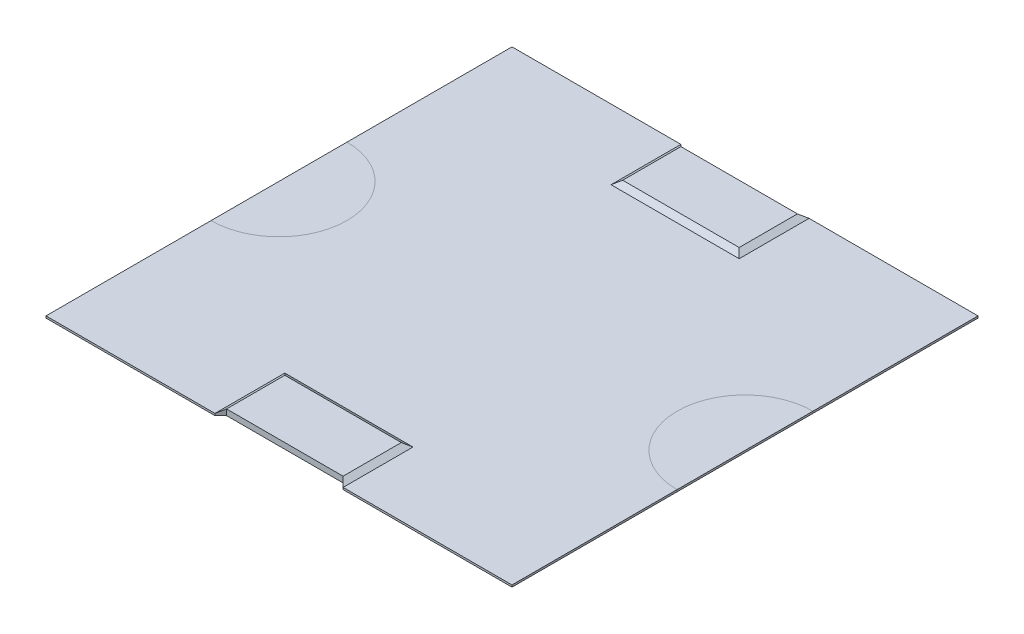
ISO-10303-21;
HEADER;
FILE_DESCRIPTION(('STEP AP214'),'2;1');
FILE_NAME('part.step','',(''),(''),'','','');
FILE_SCHEMA(('AUTOMOTIVE_DESIGN { 1 0 10303 214 1 1 1 1 }'));
ENDSEC;
DATA;
#1=APPLICATION_CONTEXT('core data for automotive mechanical design processes');
#2=APPLICATION_PROTOCOL_DEFINITION('international standard','automotive_design',2000,#1);
#3=PRODUCT_CONTEXT('',#1,'mechanical');
#4=PRODUCT('Part','Part','',(#3));
#5=PRODUCT_RELATED_PRODUCT_CATEGORY('part','',(#4));
#6=PRODUCT_DEFINITION_FORMATION('','',#4);
#7=PRODUCT_DEFINITION_CONTEXT('part definition',#1,'design');
#8=PRODUCT_DEFINITION('design','',#6,#7);
#9=PRODUCT_DEFINITION_SHAPE('','',#8);
#10=(LENGTH_UNIT() NAMED_UNIT(*) SI_UNIT(.MILLI.,.METRE.));
#11=(NAMED_UNIT(*) PLANE_ANGLE_UNIT() SI_UNIT($,.RADIAN.));
#12=(NAMED_UNIT(*) SI_UNIT($,.STERADIAN.) SOLID_ANGLE_UNIT());
#13=UNCERTAINTY_MEASURE_WITH_UNIT(LENGTH_MEASURE(1.E-05),#10,'distance_accuracy_value','');
#14=(GEOMETRIC_REPRESENTATION_CONTEXT(3) GLOBAL_UNCERTAINTY_ASSIGNED_CONTEXT((#13)) GLOBAL_UNIT_ASSIGNED_CONTEXT((#10,
#11,#12)) REPRESENTATION_CONTEXT('',''));
#15=CARTESIAN_POINT('',(0.,0.,0.));
#16=DIRECTION('',(0.,0.,1.));
#17=DIRECTION('',(1.,0.,0.));
#18=AXIS2_PLACEMENT_3D('',#15,#16,#17);
#19=CARTESIAN_POINT('',(2400.,10.,-1200.));
#20=DIRECTION('',(0.,-1.,0.));
#21=DIRECTION('',(0.,0.,-1.));
#22=AXIS2_PLACEMENT_3D('',#19,#20,#21);
#23=CYLINDRICAL_SURFACE('',#22,350.);
#24=CARTESIAN_POINT('',(2400.,0.,-1200.));
#25=DIRECTION('',(0.,1.,0.));
#26=DIRECTION('',(0.,0.,1.));
#27=AXIS2_PLACEMENT_3D('',#24,#25,#26);
#28=CIRCLE('',#27,350.);
#29=CARTESIAN_POINT('',(2400.,0.,-850.));
#30=VERTEX_POINT('',#29);
#31=CARTESIAN_POINT('',(2400.,0.,-1550.));
#32=VERTEX_POINT('',#31);
#33=EDGE_CURVE('E136',#30,#32,#28,.F.);
#34=ORIENTED_EDGE('',*,*,#33,.F.);
#35=DIRECTION('',(0.,-1.,0.));
#36=VECTOR('',#35,1.);
#37=CARTESIAN_POINT('',(2400.,10.,-850.));
#38=LINE('',#37,#36);
#39=CARTESIAN_POINT('',(2400.,10.,-850.));
#40=VERTEX_POINT('',#39);
#41=EDGE_CURVE('E13',#40,#30,#38,.T.);
#42=ORIENTED_EDGE('',*,*,#41,.F.);
#43=CARTESIAN_POINT('',(2400.,10.,-1200.));
#44=DIRECTION('',(0.,1.,0.));
#45=DIRECTION('',(0.,0.,1.));
#46=AXIS2_PLACEMENT_3D('',#43,#44,#45);
#47=CIRCLE('',#46,350.);
#48=CARTESIAN_POINT('',(2400.,10.,-1550.));
#49=VERTEX_POINT('',#48);
#50=EDGE_CURVE('E137',#40,#49,#47,.F.);
#51=ORIENTED_EDGE('',*,*,#50,.T.);
#52=DIRECTION('',(0.,-1.,0.));
#53=VECTOR('',#52,1.);
#54=CARTESIAN_POINT('',(2400.,10.,-1550.));
#55=LINE('',#54,#53);
#56=EDGE_CURVE('E116',#49,#32,#55,.T.);
#57=ORIENTED_EDGE('',*,*,#56,.T.);
#58=EDGE_LOOP('',(#34,#42,#51,#57));
#59=FACE_BOUND('',#58,.T.);
#60=ADVANCED_FACE('F108',(#59),#23,.T.);
#61=CARTESIAN_POINT('',(2400.,10.,0.));
#62=DIRECTION('',(-1.,0.,0.));
#63=DIRECTION('',(0.,0.,1.));
#64=AXIS2_PLACEMENT_3D('',#61,#62,#63);
#65=PLANE('',#64);
#66=DIRECTION('',(0.,0.,-1.));
#67=VECTOR('',#66,1.);
#68=CARTESIAN_POINT('',(2400.,0.,0.));
#69=LINE('',#68,#67);
#70=EDGE_CURVE('E138',#30,#32,#69,.T.);
#71=ORIENTED_EDGE('',*,*,#70,.T.);
#72=ORIENTED_EDGE('',*,*,#56,.F.);
#73=DIRECTION('',(0.,0.,-1.));
#74=VECTOR('',#73,1.);
#75=CARTESIAN_POINT('',(2400.,10.,0.));
#76=LINE('',#75,#74);
#77=EDGE_CURVE('E123',#40,#49,#76,.T.);
#78=ORIENTED_EDGE('',*,*,#77,.F.);
#79=ORIENTED_EDGE('',*,*,#41,.T.);
#80=EDGE_LOOP('',(#71,#72,#78,#79));
#81=FACE_BOUND('',#80,.T.);
#82=ADVANCED_FACE('F139',(#81),#65,.F.);
#83=CARTESIAN_POINT('',(0.,10.,0.));
#84=DIRECTION('',(0.,1.,0.));
#85=DIRECTION('',(0.,0.,1.));
#86=AXIS2_PLACEMENT_3D('',#83,#84,#85);
#87=PLANE('',#86);
#88=ORIENTED_EDGE('',*,*,#50,.F.);
#89=ORIENTED_EDGE('',*,*,#77,.T.);
#90=EDGE_LOOP('',(#88,#89));
#91=FACE_BOUND('',#90,.T.);
#92=ADVANCED_FACE('F147',(#91),#87,.T.);
#93=CARTESIAN_POINT('',(0.,0.,0.));
#94=DIRECTION('',(0.,1.,0.));
#95=DIRECTION('',(0.,0.,1.));
#96=AXIS2_PLACEMENT_3D('',#93,#94,#95);
#97=PLANE('',#96);
#98=ORIENTED_EDGE('',*,*,#33,.T.);
#99=ORIENTED_EDGE('',*,*,#70,.F.);
#100=EDGE_LOOP('',(#98,#99));
#101=FACE_BOUND('',#100,.T.);
#102=ADVANCED_FACE('F142',(#101),#97,.F.);
#103=CLOSED_SHELL('',(#60,#82,#92,#102));
#104=MANIFOLD_SOLID_BREP('B2',#103);
#105=CARTESIAN_POINT('',(0.,10.,0.));
#106=DIRECTION('',(-1.,0.,0.));
#107=DIRECTION('',(0.,0.,1.));
#108=AXIS2_PLACEMENT_3D('',#105,#106,#107);
#109=PLANE('',#108);
#110=DIRECTION('',(0.,0.,-1.));
#111=VECTOR('',#110,1.);
#112=CARTESIAN_POINT('',(0.,0.,0.));
#113=LINE('',#112,#111);
#114=CARTESIAN_POINT('',(0.,0.,-850.));
#115=VERTEX_POINT('',#114);
#116=CARTESIAN_POINT('',(0.,0.,-1550.));
#117=VERTEX_POINT('',#116);
#118=EDGE_CURVE('E233',#115,#117,#113,.T.);
#119=ORIENTED_EDGE('',*,*,#118,.F.);
#120=DIRECTION('',(0.,-1.,0.));
#121=VECTOR('',#120,1.);
#122=CARTESIAN_POINT('',(0.,10.,-850.));
#123=LINE('',#122,#121);
#124=CARTESIAN_POINT('',(0.,10.,-850.));
#125=VERTEX_POINT('',#124);
#126=EDGE_CURVE('E106',#125,#115,#123,.T.);
#127=ORIENTED_EDGE('',*,*,#126,.F.);
#128=DIRECTION('',(0.,0.,-1.));
#129=VECTOR('',#128,1.);
#130=CARTESIAN_POINT('',(0.,10.,0.));
#131=LINE('',#130,#129);
#132=CARTESIAN_POINT('',(0.,10.,-1550.));
#133=VERTEX_POINT('',#132);
#134=EDGE_CURVE('E234',#125,#133,#131,.T.);
#135=ORIENTED_EDGE('',*,*,#134,.T.);
#136=DIRECTION('',(0.,-1.,0.));
#137=VECTOR('',#136,1.);
#138=CARTESIAN_POINT('',(0.,10.,-1550.));
#139=LINE('',#138,#137);
#140=EDGE_CURVE('E213',#133,#117,#139,.T.);
#141=ORIENTED_EDGE('',*,*,#140,.T.);
#142=EDGE_LOOP('',(#119,#127,#135,#141));
#143=FACE_BOUND('',#142,.T.);
#144=ADVANCED_FACE('F205',(#143),#109,.T.);
#145=CARTESIAN_POINT('',(0.,10.,-1200.));
#146=DIRECTION('',(0.,-1.,0.));
#147=DIRECTION('',(0.,0.,-1.));
#148=AXIS2_PLACEMENT_3D('',#145,#146,#147);
#149=CYLINDRICAL_SURFACE('',#148,350.);
#150=CARTESIAN_POINT('',(0.,0.,-1200.));
#151=DIRECTION('',(0.,1.,0.));
#152=DIRECTION('',(0.,0.,1.));
#153=AXIS2_PLACEMENT_3D('',#150,#151,#152);
#154=CIRCLE('',#153,350.);
#155=EDGE_CURVE('E235',#115,#117,#154,.T.);
#156=ORIENTED_EDGE('',*,*,#155,.T.);
#157=ORIENTED_EDGE('',*,*,#140,.F.);
#158=CARTESIAN_POINT('',(0.,10.,-1200.));
#159=DIRECTION('',(0.,1.,0.));
#160=DIRECTION('',(0.,0.,1.));
#161=AXIS2_PLACEMENT_3D('',#158,#159,#160);
#162=CIRCLE('',#161,350.);
#163=EDGE_CURVE('E220',#125,#133,#162,.T.);
#164=ORIENTED_EDGE('',*,*,#163,.F.);
#165=ORIENTED_EDGE('',*,*,#126,.T.);
#166=EDGE_LOOP('',(#156,#157,#164,#165));
#167=FACE_BOUND('',#166,.T.);
#168=ADVANCED_FACE('F236',(#167),#149,.T.);
#169=CARTESIAN_POINT('',(0.,10.,0.));
#170=DIRECTION('',(0.,1.,0.));
#171=DIRECTION('',(0.,0.,1.));
#172=AXIS2_PLACEMENT_3D('',#169,#170,#171);
#173=PLANE('',#172);
#174=ORIENTED_EDGE('',*,*,#134,.F.);
#175=ORIENTED_EDGE('',*,*,#163,.T.);
#176=EDGE_LOOP('',(#174,#175));
#177=FACE_BOUND('',#176,.T.);
#178=ADVANCED_FACE('F244',(#177),#173,.T.);
#179=CARTESIAN_POINT('',(0.,0.,0.));
#180=DIRECTION('',(0.,1.,0.));
#181=DIRECTION('',(0.,0.,1.));
#182=AXIS2_PLACEMENT_3D('',#179,#180,#181);
#183=PLANE('',#182);
#184=ORIENTED_EDGE('',*,*,#118,.T.);
#185=ORIENTED_EDGE('',*,*,#155,.F.);
#186=EDGE_LOOP('',(#184,#185));
#187=FACE_BOUND('',#186,.T.);
#188=ADVANCED_FACE('F239',(#187),#183,.F.);
#189=CLOSED_SHELL('',(#144,#168,#178,#188));
#190=MANIFOLD_SOLID_BREP('B7',#189);
#191=CARTESIAN_POINT('',(2400.,10.,0.));
#192=DIRECTION('',(-1.,0.,0.));
#193=DIRECTION('',(0.,0.,1.));
#194=AXIS2_PLACEMENT_3D('',#191,#192,#193);
#195=PLANE('',#194);
#196=DIRECTION('',(0.,0.,-1.));
#197=VECTOR('',#196,1.);
#198=CARTESIAN_POINT('',(2400.,0.,0.));
#199=LINE('',#198,#197);
#200=CARTESIAN_POINT('',(2400.,0.,0.));
#201=VERTEX_POINT('',#200);
#202=CARTESIAN_POINT('',(2400.,0.,-850.));
#203=VERTEX_POINT('',#202);
#204=EDGE_CURVE('E767',#201,#203,#199,.T.);
#205=ORIENTED_EDGE('',*,*,#204,.T.);
#206=DIRECTION('',(0.,-1.,0.));
#207=VECTOR('',#206,1.);
#208=CARTESIAN_POINT('',(2400.,10.,-850.));
#209=LINE('',#208,#207);
#210=CARTESIAN_POINT('',(2400.,10.,-850.));
#211=VERTEX_POINT('',#210);
#212=EDGE_CURVE('E203',#211,#203,#209,.T.);
#213=ORIENTED_EDGE('',*,*,#212,.F.);
#214=DIRECTION('',(0.,0.,-1.));
#215=VECTOR('',#214,1.);
#216=CARTESIAN_POINT('',(2400.,10.,0.));
#217=LINE('',#216,#215);
#218=CARTESIAN_POINT('',(2400.,10.,0.));
#219=VERTEX_POINT('',#218);
#220=EDGE_CURVE('E720',#219,#211,#217,.T.);
#221=ORIENTED_EDGE('',*,*,#220,.F.);
#222=DIRECTION('',(0.,-1.,0.));
#223=VECTOR('',#222,1.);
#224=CARTESIAN_POINT('',(2400.,10.,0.));
#225=LINE('',#224,#223);
#226=EDGE_CURVE('E662',#219,#201,#225,.T.);
#227=ORIENTED_EDGE('',*,*,#226,.T.);
#228=EDGE_LOOP('',(#205,#213,#221,#227));
#229=FACE_BOUND('',#228,.T.);
#230=ADVANCED_FACE('F293',(#229),#195,.F.);
#231=CARTESIAN_POINT('',(2400.,10.,-1200.));
#232=DIRECTION('',(0.,-1.,0.));
#233=DIRECTION('',(0.,0.,-1.));
#234=AXIS2_PLACEMENT_3D('',#231,#232,#233);
#235=CYLINDRICAL_SURFACE('',#234,350.);
#236=CARTESIAN_POINT('',(2400.,0.,-1200.));
#237=DIRECTION('',(0.,1.,0.));
#238=DIRECTION('',(0.,0.,1.));
#239=AXIS2_PLACEMENT_3D('',#236,#237,#238);
#240=CIRCLE('',#239,350.);
#241=CARTESIAN_POINT('',(2400.,0.,-1550.));
#242=VERTEX_POINT('',#241);
#243=EDGE_CURVE('E652',#203,#242,#240,.F.);
#244=ORIENTED_EDGE('',*,*,#243,.T.);
#245=DIRECTION('',(0.,-1.,0.));
#246=VECTOR('',#245,1.);
#247=CARTESIAN_POINT('',(2400.,10.,-1550.));
#248=LINE('',#247,#246);
#249=CARTESIAN_POINT('',(2400.,10.,-1550.));
#250=VERTEX_POINT('',#249);
#251=EDGE_CURVE('E303',#250,#242,#248,.T.);
#252=ORIENTED_EDGE('',*,*,#251,.F.);
#253=CARTESIAN_POINT('',(2400.,10.,-1200.));
#254=DIRECTION('',(0.,1.,0.));
#255=DIRECTION('',(0.,0.,1.));
#256=AXIS2_PLACEMENT_3D('',#253,#254,#255);
#257=CIRCLE('',#256,350.);
#258=EDGE_CURVE('E722',#211,#250,#257,.F.);
#259=ORIENTED_EDGE('',*,*,#258,.F.);
#260=ORIENTED_EDGE('',*,*,#212,.T.);
#261=EDGE_LOOP('',(#244,#252,#259,#260));
#262=FACE_BOUND('',#261,.T.);
#263=ADVANCED_FACE('F295',(#262),#235,.F.);
#264=CARTESIAN_POINT('',(2400.,0.,-2400.));
#265=VERTEX_POINT('',#264);
#266=EDGE_CURVE('E646',#242,#265,#199,.T.);
#267=ORIENTED_EDGE('',*,*,#266,.T.);
#268=DIRECTION('',(0.,-1.,0.));
#269=VECTOR('',#268,1.);
#270=CARTESIAN_POINT('',(2400.,10.,-2400.));
#271=LINE('',#270,#269);
#272=CARTESIAN_POINT('',(2400.,10.,-2400.));
#273=VERTEX_POINT('',#272);
#274=EDGE_CURVE('E672',#273,#265,#271,.T.);
#275=ORIENTED_EDGE('',*,*,#274,.F.);
#276=EDGE_CURVE('E723',#250,#273,#217,.T.);
#277=ORIENTED_EDGE('',*,*,#276,.F.);
#278=ORIENTED_EDGE('',*,*,#251,.T.);
#279=EDGE_LOOP('',(#267,#275,#277,#278));
#280=FACE_BOUND('',#279,.T.);
#281=ADVANCED_FACE('F750',(#280),#195,.F.);
#282=CARTESIAN_POINT('',(0.,10.,-2400.));
#283=DIRECTION('',(0.,0.,-1.));
#284=DIRECTION('',(-1.,0.,0.));
#285=AXIS2_PLACEMENT_3D('',#282,#283,#284);
#286=PLANE('',#285);
#287=DIRECTION('',(1.,0.,0.));
#288=VECTOR('',#287,1.);
#289=CARTESIAN_POINT('',(0.,0.,-2400.));
#290=LINE('',#289,#288);
#291=CARTESIAN_POINT('',(1530.,0.,-2400.));
#292=VERTEX_POINT('',#291);
#293=EDGE_CURVE('E641',#292,#265,#290,.T.);
#294=ORIENTED_EDGE('',*,*,#293,.F.);
#295=CARTESIAN_POINT('',(1530.,10.,-2400.));
#296=DIRECTION('',(0.,-1.,0.));
#297=VECTOR('',#296,1.);
#298=LINE('',#295,#297);
#299=CARTESIAN_POINT('',(1530.,10.,-2400.));
#300=VERTEX_POINT('',#299);
#301=EDGE_CURVE('E674',#300,#292,#298,.T.);
#302=ORIENTED_EDGE('',*,*,#301,.F.);
#303=DIRECTION('',(1.,0.,0.));
#304=VECTOR('',#303,1.);
#305=CARTESIAN_POINT('',(0.,10.,-2400.));
#306=LINE('',#305,#304);
#307=EDGE_CURVE('E731',#300,#273,#306,.T.);
#308=ORIENTED_EDGE('',*,*,#307,.T.);
#309=ORIENTED_EDGE('',*,*,#274,.T.);
#310=EDGE_LOOP('',(#294,#302,#308,#309));
#311=FACE_BOUND('',#310,.T.);
#312=ADVANCED_FACE('F746',(#311),#286,.T.);
#313=CARTESIAN_POINT('',(0.,0.,-2400.));
#314=VERTEX_POINT('',#313);
#315=CARTESIAN_POINT('',(870.,0.,-2400.));
#316=VERTEX_POINT('',#315);
#317=EDGE_CURVE('E645',#314,#316,#290,.T.);
#318=ORIENTED_EDGE('',*,*,#317,.F.);
#319=DIRECTION('',(0.,-1.,0.));
#320=VECTOR('',#319,1.);
#321=CARTESIAN_POINT('',(0.,10.,-2400.));
#322=LINE('',#321,#320);
#323=CARTESIAN_POINT('',(0.,10.,-2400.));
#324=VERTEX_POINT('',#323);
#325=EDGE_CURVE('E670',#324,#314,#322,.T.);
#326=ORIENTED_EDGE('',*,*,#325,.F.);
#327=CARTESIAN_POINT('',(870.,9.99999999999998,-2400.));
#328=VERTEX_POINT('',#327);
#329=EDGE_CURVE('E725',#324,#328,#306,.T.);
#330=ORIENTED_EDGE('',*,*,#329,.T.);
#331=DIRECTION('',(0.,1.,0.));
#332=VECTOR('',#331,1.);
#333=CARTESIAN_POINT('',(870.,10.,-2400.));
#334=LINE('',#333,#332);
#335=EDGE_CURVE('E568',#328,#316,#334,.F.);
#336=ORIENTED_EDGE('',*,*,#335,.T.);
#337=EDGE_LOOP('',(#318,#326,#330,#336));
#338=FACE_BOUND('',#337,.T.);
#339=ADVANCED_FACE('F736',(#338),#286,.T.);
#340=CARTESIAN_POINT('',(0.,10.,0.));
#341=DIRECTION('',(-1.,0.,0.));
#342=DIRECTION('',(0.,0.,1.));
#343=AXIS2_PLACEMENT_3D('',#340,#341,#342);
#344=PLANE('',#343);
#345=DIRECTION('',(0.,0.,-1.));
#346=VECTOR('',#345,1.);
#347=CARTESIAN_POINT('',(0.,0.,0.));
#348=LINE('',#347,#346);
#349=CARTESIAN_POINT('',(0.,0.,-1550.));
#350=VERTEX_POINT('',#349);
#351=EDGE_CURVE('E651',#350,#314,#348,.T.);
#352=ORIENTED_EDGE('',*,*,#351,.F.);
#353=DIRECTION('',(0.,-1.,0.));
#354=VECTOR('',#353,1.);
#355=CARTESIAN_POINT('',(0.,10.,-1550.));
#356=LINE('',#355,#354);
#357=CARTESIAN_POINT('',(0.,10.,-1550.));
#358=VERTEX_POINT('',#357);
#359=EDGE_CURVE('E668',#358,#350,#356,.T.);
#360=ORIENTED_EDGE('',*,*,#359,.F.);
#361=DIRECTION('',(0.,0.,-1.));
#362=VECTOR('',#361,1.);
#363=CARTESIAN_POINT('',(0.,10.,0.));
#364=LINE('',#363,#362);
#365=EDGE_CURVE('E729',#358,#324,#364,.T.);
#366=ORIENTED_EDGE('',*,*,#365,.T.);
#367=ORIENTED_EDGE('',*,*,#325,.T.);
#368=EDGE_LOOP('',(#352,#360,#366,#367));
#369=FACE_BOUND('',#368,.T.);
#370=ADVANCED_FACE('F745',(#369),#344,.T.);
#371=CARTESIAN_POINT('',(0.,10.,-1200.));
#372=DIRECTION('',(0.,-1.,0.));
#373=DIRECTION('',(0.,0.,-1.));
#374=AXIS2_PLACEMENT_3D('',#371,#372,#373);
#375=CYLINDRICAL_SURFACE('',#374,350.);
#376=CARTESIAN_POINT('',(0.,0.,-1200.));
#377=DIRECTION('',(0.,1.,0.));
#378=DIRECTION('',(0.,0.,1.));
#379=AXIS2_PLACEMENT_3D('',#376,#377,#378);
#380=CIRCLE('',#379,350.);
#381=CARTESIAN_POINT('',(0.,0.,-850.));
#382=VERTEX_POINT('',#381);
#383=EDGE_CURVE('E656',#382,#350,#380,.T.);
#384=ORIENTED_EDGE('',*,*,#383,.F.);
#385=DIRECTION('',(0.,-1.,0.));
#386=VECTOR('',#385,1.);
#387=CARTESIAN_POINT('',(0.,10.,-850.));
#388=LINE('',#387,#386);
#389=CARTESIAN_POINT('',(0.,10.,-850.));
#390=VERTEX_POINT('',#389);
#391=EDGE_CURVE('E666',#390,#382,#388,.T.);
#392=ORIENTED_EDGE('',*,*,#391,.F.);
#393=CARTESIAN_POINT('',(0.,10.,-1200.));
#394=DIRECTION('',(0.,1.,0.));
#395=DIRECTION('',(0.,0.,1.));
#396=AXIS2_PLACEMENT_3D('',#393,#394,#395);
#397=CIRCLE('',#396,350.);
#398=EDGE_CURVE('E1127',#390,#358,#397,.T.);
#399=ORIENTED_EDGE('',*,*,#398,.T.);
#400=ORIENTED_EDGE('',*,*,#359,.T.);
#401=EDGE_LOOP('',(#384,#392,#399,#400));
#402=FACE_BOUND('',#401,.T.);
#403=ADVANCED_FACE('F748',(#402),#375,.F.);
#404=CARTESIAN_POINT('',(0.,0.,0.));
#405=VERTEX_POINT('',#404);
#406=EDGE_CURVE('E657',#405,#382,#348,.T.);
#407=ORIENTED_EDGE('',*,*,#406,.F.);
#408=DIRECTION('',(0.,-1.,0.));
#409=VECTOR('',#408,1.);
#410=CARTESIAN_POINT('',(0.,10.,0.));
#411=LINE('',#410,#409);
#412=CARTESIAN_POINT('',(0.,10.,0.));
#413=VERTEX_POINT('',#412);
#414=EDGE_CURVE('E441',#413,#405,#411,.T.);
#415=ORIENTED_EDGE('',*,*,#414,.F.);
#416=EDGE_CURVE('E454',#413,#390,#364,.T.);
#417=ORIENTED_EDGE('',*,*,#416,.T.);
#418=ORIENTED_EDGE('',*,*,#391,.T.);
#419=EDGE_LOOP('',(#407,#415,#417,#418));
#420=FACE_BOUND('',#419,.T.);
#421=ADVANCED_FACE('F883',(#420),#344,.T.);
#422=CARTESIAN_POINT('',(0.,10.,0.));
#423=DIRECTION('',(0.,0.,-1.));
#424=DIRECTION('',(-1.,0.,0.));
#425=AXIS2_PLACEMENT_3D('',#422,#423,#424);
#426=PLANE('',#425);
#427=DIRECTION('',(1.,0.,0.));
#428=VECTOR('',#427,1.);
#429=CARTESIAN_POINT('',(0.,0.,0.));
#430=LINE('',#429,#428);
#431=CARTESIAN_POINT('',(870.,0.,0.));
#432=VERTEX_POINT('',#431);
#433=EDGE_CURVE('E461',#405,#432,#430,.T.);
#434=ORIENTED_EDGE('',*,*,#433,.T.);
#435=DIRECTION('',(0.,-1.,0.));
#436=VECTOR('',#435,1.);
#437=CARTESIAN_POINT('',(870.,10.,0.));
#438=LINE('',#437,#436);
#439=CARTESIAN_POINT('',(870.,10.,0.));
#440=VERTEX_POINT('',#439);
#441=EDGE_CURVE('E458',#440,#432,#438,.T.);
#442=ORIENTED_EDGE('',*,*,#441,.F.);
#443=DIRECTION('',(1.,0.,0.));
#444=VECTOR('',#443,1.);
#445=CARTESIAN_POINT('',(0.,10.,0.));
#446=LINE('',#445,#444);
#447=EDGE_CURVE('E446',#413,#440,#446,.T.);
#448=ORIENTED_EDGE('',*,*,#447,.F.);
#449=ORIENTED_EDGE('',*,*,#414,.T.);
#450=EDGE_LOOP('',(#434,#442,#448,#449));
#451=FACE_BOUND('',#450,.T.);
#452=ADVANCED_FACE('F459',(#451),#426,.F.);
#453=CARTESIAN_POINT('',(1530.,0.,0.));
#454=VERTEX_POINT('',#453);
#455=EDGE_CURVE('E661',#454,#201,#430,.T.);
#456=ORIENTED_EDGE('',*,*,#455,.T.);
#457=ORIENTED_EDGE('',*,*,#226,.F.);
#458=CARTESIAN_POINT('',(1530.,9.99999999999997,0.));
#459=VERTEX_POINT('',#458);
#460=EDGE_CURVE('E312',#459,#219,#446,.T.);
#461=ORIENTED_EDGE('',*,*,#460,.F.);
#462=DIRECTION('',(0.,1.,0.));
#463=VECTOR('',#462,1.);
#464=CARTESIAN_POINT('',(1530.,10.,0.));
#465=LINE('',#464,#463);
#466=EDGE_CURVE('E466',#459,#454,#465,.F.);
#467=ORIENTED_EDGE('',*,*,#466,.T.);
#468=EDGE_LOOP('',(#456,#457,#461,#467));
#469=FACE_BOUND('',#468,.T.);
#470=ADVANCED_FACE('F538',(#469),#426,.F.);
#471=CARTESIAN_POINT('',(0.,10.,0.));
#472=DIRECTION('',(0.,1.,0.));
#473=DIRECTION('',(0.,0.,1.));
#474=AXIS2_PLACEMENT_3D('',#471,#472,#473);
#475=PLANE('',#474);
#476=ORIENTED_EDGE('',*,*,#220,.T.);
#477=ORIENTED_EDGE('',*,*,#258,.T.);
#478=ORIENTED_EDGE('',*,*,#276,.T.);
#479=ORIENTED_EDGE('',*,*,#307,.F.);
#480=CARTESIAN_POINT('',(1530.,9.99999999999956,-2040.));
#481=DIRECTION('',(0.,0.,-1.));
#482=VECTOR('',#481,1.);
#483=LINE('',#480,#482);
#484=CARTESIAN_POINT('',(1530.,10.,-2040.));
#485=VERTEX_POINT('',#484);
#486=EDGE_CURVE('E638',#485,#300,#483,.T.);
#487=ORIENTED_EDGE('',*,*,#486,.F.);
#488=DIRECTION('',(1.,0.,0.));
#489=VECTOR('',#488,1.);
#490=CARTESIAN_POINT('',(0.,10.,-2040.));
#491=LINE('',#490,#489);
#492=CARTESIAN_POINT('',(870.,10.0000000000001,-2040.));
#493=VERTEX_POINT('',#492);
#494=EDGE_CURVE('E635',#493,#485,#491,.T.);
#495=ORIENTED_EDGE('',*,*,#494,.F.);
#496=DIRECTION('',(0.,0.,1.));
#497=VECTOR('',#496,1.);
#498=CARTESIAN_POINT('',(870.,10.,0.));
#499=LINE('',#498,#497);
#500=EDGE_CURVE('E637',#493,#328,#499,.F.);
#501=ORIENTED_EDGE('',*,*,#500,.T.);
#502=ORIENTED_EDGE('',*,*,#329,.F.);
#503=ORIENTED_EDGE('',*,*,#365,.F.);
#504=ORIENTED_EDGE('',*,*,#398,.F.);
#505=ORIENTED_EDGE('',*,*,#416,.F.);
#506=ORIENTED_EDGE('',*,*,#447,.T.);
#507=DIRECTION('',(0.,0.,1.));
#508=VECTOR('',#507,1.);
#509=CARTESIAN_POINT('',(870.,10.,0.));
#510=LINE('',#509,#508);
#511=CARTESIAN_POINT('',(870.,10.,-359.999999999999));
#512=VERTEX_POINT('',#511);
#513=EDGE_CURVE('E451',#512,#440,#510,.T.);
#514=ORIENTED_EDGE('',*,*,#513,.F.);
#515=DIRECTION('',(1.,0.,0.));
#516=VECTOR('',#515,1.);
#517=CARTESIAN_POINT('',(0.,10.,-359.999999999999));
#518=LINE('',#517,#516);
#519=CARTESIAN_POINT('',(1530.,10.,-359.999999999999));
#520=VERTEX_POINT('',#519);
#521=EDGE_CURVE('E474',#512,#520,#518,.T.);
#522=ORIENTED_EDGE('',*,*,#521,.T.);
#523=DIRECTION('',(0.,0.,1.));
#524=VECTOR('',#523,1.);
#525=CARTESIAN_POINT('',(1530.,10.,0.));
#526=LINE('',#525,#524);
#527=EDGE_CURVE('E714',#520,#459,#526,.T.);
#528=ORIENTED_EDGE('',*,*,#527,.T.);
#529=ORIENTED_EDGE('',*,*,#460,.T.);
#530=EDGE_LOOP('',(#476,#477,#478,#479,#487,#495,#501,#502,#503,#504,#505,#506,#514,#522,#528,#529));
#531=FACE_BOUND('',#530,.T.);
#532=ADVANCED_FACE('F448',(#531),#475,.T.);
#533=CARTESIAN_POINT('',(0.,0.,0.));
#534=DIRECTION('',(0.,1.,0.));
#535=DIRECTION('',(0.,0.,1.));
#536=AXIS2_PLACEMENT_3D('',#533,#534,#535);
#537=PLANE('',#536);
#538=DIRECTION('',(0.70710678118655,0.,-0.707106781186545));
#539=VECTOR('',#538,1.);
#540=CARTESIAN_POINT('',(1500.,0.,-2370.));
#541=LINE('',#540,#539);
#542=CARTESIAN_POINT('',(1500.,0.,-2370.));
#543=VERTEX_POINT('',#542);
#544=EDGE_CURVE('E774',#543,#292,#541,.T.);
#545=ORIENTED_EDGE('',*,*,#544,.T.);
#546=ORIENTED_EDGE('',*,*,#293,.T.);
#547=ORIENTED_EDGE('',*,*,#266,.F.);
#548=ORIENTED_EDGE('',*,*,#243,.F.);
#549=ORIENTED_EDGE('',*,*,#204,.F.);
#550=ORIENTED_EDGE('',*,*,#455,.F.);
#551=DIRECTION('',(-0.70710678118655,0.,-0.707106781186545));
#552=VECTOR('',#551,1.);
#553=CARTESIAN_POINT('',(1530.,0.,0.));
#554=LINE('',#553,#552);
#555=CARTESIAN_POINT('',(1500.,0.,-29.9999999999998));
#556=VERTEX_POINT('',#555);
#557=EDGE_CURVE('E499',#454,#556,#554,.T.);
#558=ORIENTED_EDGE('',*,*,#557,.T.);
#559=DIRECTION('',(1.,0.,0.));
#560=VECTOR('',#559,1.);
#561=CARTESIAN_POINT('',(0.,0.,-29.9999999999998));
#562=LINE('',#561,#560);
#563=CARTESIAN_POINT('',(900.,0.,-29.9999999999998));
#564=VERTEX_POINT('',#563);
#565=EDGE_CURVE('E481',#564,#556,#562,.T.);
#566=ORIENTED_EDGE('',*,*,#565,.F.);
#567=DIRECTION('',(-0.70710678118655,0.,0.707106781186545));
#568=VECTOR('',#567,1.);
#569=CARTESIAN_POINT('',(900.,0.,-29.9999999999998));
#570=LINE('',#569,#568);
#571=EDGE_CURVE('E479',#564,#432,#570,.T.);
#572=ORIENTED_EDGE('',*,*,#571,.T.);
#573=ORIENTED_EDGE('',*,*,#433,.F.);
#574=ORIENTED_EDGE('',*,*,#406,.T.);
#575=ORIENTED_EDGE('',*,*,#383,.T.);
#576=ORIENTED_EDGE('',*,*,#351,.T.);
#577=ORIENTED_EDGE('',*,*,#317,.T.);
#578=DIRECTION('',(0.70710678118655,0.,0.707106781186545));
#579=VECTOR('',#578,1.);
#580=CARTESIAN_POINT('',(870.,0.,-2400.));
#581=LINE('',#580,#579);
#582=CARTESIAN_POINT('',(900.,0.,-2370.));
#583=VERTEX_POINT('',#582);
#584=EDGE_CURVE('E1135',#316,#583,#581,.T.);
#585=ORIENTED_EDGE('',*,*,#584,.T.);
#586=DIRECTION('',(1.,0.,0.));
#587=VECTOR('',#586,1.);
#588=CARTESIAN_POINT('',(0.,0.,-2370.));
#589=LINE('',#588,#587);
#590=EDGE_CURVE('E552',#583,#543,#589,.T.);
#591=ORIENTED_EDGE('',*,*,#590,.T.);
#592=EDGE_LOOP('',(#545,#546,#547,#548,#549,#550,#558,#566,#572,#573,#574,#575,#576,#577,#585,#591));
#593=FACE_BOUND('',#592,.T.);
#594=ADVANCED_FACE('F537',(#593),#537,.F.);
#595=CARTESIAN_POINT('',(475.384615384615,713.076923076923,0.));
#596=DIRECTION('',(-0.554700196225229,-0.832050294337844,0.));
#597=DIRECTION('',(0.832050294337844,-0.554700196225229,0.));
#598=AXIS2_PLACEMENT_3D('',#595,#596,#597);
#599=PLANE('',#598);
#600=DIRECTION('',(-0.639602149066833,0.426401432711222,0.639602149066829));
#601=VECTOR('',#600,1.);
#602=CARTESIAN_POINT('',(1530.,10.,-359.999999999999));
#603=LINE('',#602,#601);
#604=CARTESIAN_POINT('',(1500.,30.,-330.));
#605=VERTEX_POINT('',#604);
#606=EDGE_CURVE('E492',#520,#605,#603,.T.);
#607=ORIENTED_EDGE('',*,*,#606,.T.);
#608=DIRECTION('',(0.,0.,-1.));
#609=VECTOR('',#608,1.);
#610=CARTESIAN_POINT('',(1500.,30.,0.));
#611=LINE('',#610,#609);
#612=CARTESIAN_POINT('',(1500.,30.,-29.9999999999998));
#613=VERTEX_POINT('',#612);
#614=EDGE_CURVE('E501',#613,#605,#611,.T.);
#615=ORIENTED_EDGE('',*,*,#614,.F.);
#616=DIRECTION('',(-0.639602149066833,0.426401432711222,-0.639602149066829));
#617=VECTOR('',#616,1.);
#618=CARTESIAN_POINT('',(1530.,10.,0.));
#619=LINE('',#618,#617);
#620=EDGE_CURVE('E496',#459,#613,#619,.T.);
#621=ORIENTED_EDGE('',*,*,#620,.F.);
#622=ORIENTED_EDGE('',*,*,#527,.F.);
#623=EDGE_LOOP('',(#607,#615,#621,#622));
#624=FACE_BOUND('',#623,.T.);
#625=ADVANCED_FACE('F531',(#624),#599,.F.);
#626=CARTESIAN_POINT('',(764.999999999994,0.,-765.));
#627=DIRECTION('',(-0.707106781186545,0.,0.70710678118655));
#628=DIRECTION('',(0.70710678118655,0.,0.707106781186545));
#629=AXIS2_PLACEMENT_3D('',#626,#627,#628);
#630=PLANE('',#629);
#631=ORIENTED_EDGE('',*,*,#620,.T.);
#632=DIRECTION('',(0.,-1.,0.));
#633=VECTOR('',#632,1.);
#634=CARTESIAN_POINT('',(1500.,30.,-29.9999999999998));
#635=LINE('',#634,#633);
#636=EDGE_CURVE('E513',#613,#556,#635,.T.);
#637=ORIENTED_EDGE('',*,*,#636,.T.);
#638=ORIENTED_EDGE('',*,*,#557,.F.);
#639=ORIENTED_EDGE('',*,*,#466,.F.);
#640=EDGE_LOOP('',(#631,#637,#638,#639));
#641=FACE_BOUND('',#640,.T.);
#642=ADVANCED_FACE('F520',(#641),#630,.T.);
#643=CARTESIAN_POINT('',(0.,30.,-29.9999999999998));
#644=DIRECTION('',(0.,0.,-1.));
#645=DIRECTION('',(-1.,0.,0.));
#646=AXIS2_PLACEMENT_3D('',#643,#644,#645);
#647=PLANE('',#646);
#648=ORIENTED_EDGE('',*,*,#565,.T.);
#649=ORIENTED_EDGE('',*,*,#636,.F.);
#650=DIRECTION('',(1.,0.,0.));
#651=VECTOR('',#650,1.);
#652=CARTESIAN_POINT('',(0.,30.,-29.9999999999998));
#653=LINE('',#652,#651);
#654=CARTESIAN_POINT('',(900.,30.,-29.9999999999998));
#655=VERTEX_POINT('',#654);
#656=EDGE_CURVE('E688',#655,#613,#653,.T.);
#657=ORIENTED_EDGE('',*,*,#656,.F.);
#658=DIRECTION('',(0.,-1.,0.));
#659=VECTOR('',#658,1.);
#660=CARTESIAN_POINT('',(900.,30.,-29.9999999999998));
#661=LINE('',#660,#659);
#662=EDGE_CURVE('E478',#655,#564,#661,.T.);
#663=ORIENTED_EDGE('',*,*,#662,.T.);
#664=EDGE_LOOP('',(#648,#649,#657,#663));
#665=FACE_BOUND('',#664,.T.);
#666=ADVANCED_FACE('F530',(#665),#647,.F.);
#667=CARTESIAN_POINT('',(0.,30.,0.));
#668=DIRECTION('',(0.,1.,0.));
#669=DIRECTION('',(0.,0.,1.));
#670=AXIS2_PLACEMENT_3D('',#667,#668,#669);
#671=PLANE('',#670);
#672=DIRECTION('',(0.,0.,-1.));
#673=VECTOR('',#672,1.);
#674=CARTESIAN_POINT('',(900.,30.,0.));
#675=LINE('',#674,#673);
#676=CARTESIAN_POINT('',(899.9999825,30.,-329.999999999999));
#677=VERTEX_POINT('',#676);
#678=EDGE_CURVE('E1164',#655,#677,#675,.T.);
#679=ORIENTED_EDGE('',*,*,#678,.F.);
#680=ORIENTED_EDGE('',*,*,#656,.T.);
#681=ORIENTED_EDGE('',*,*,#614,.T.);
#682=CARTESIAN_POINT('',(900.,29.9999999999998,-329.999999999999));
#683=DIRECTION('',(1.,0.,0.));
#684=VECTOR('',#683,1.);
#685=LINE('',#682,#684);
#686=EDGE_CURVE('E493',#677,#605,#685,.T.);
#687=ORIENTED_EDGE('',*,*,#686,.F.);
#688=EDGE_LOOP('',(#679,#680,#681,#687));
#689=FACE_BOUND('',#688,.T.);
#690=ADVANCED_FACE('F690',(#689),#671,.T.);
#691=CARTESIAN_POINT('',(263.076923076923,-394.615384615384,0.));
#692=DIRECTION('',(-0.554700196225229,0.832050294337844,0.));
#693=DIRECTION('',(-0.832050294337844,-0.554700196225229,0.));
#694=AXIS2_PLACEMENT_3D('',#691,#692,#693);
#695=PLANE('',#694);
#696=DIRECTION('',(-0.639602149066833,-0.426401432711222,-0.639602149066829));
#697=VECTOR('',#696,1.);
#698=CARTESIAN_POINT('',(900.,30.,-330.));
#699=LINE('',#698,#697);
#700=EDGE_CURVE('E473',#677,#512,#699,.T.);
#701=ORIENTED_EDGE('',*,*,#700,.T.);
#702=ORIENTED_EDGE('',*,*,#513,.T.);
#703=DIRECTION('',(-0.639602149066833,-0.426401432711222,0.639602149066829));
#704=VECTOR('',#703,1.);
#705=CARTESIAN_POINT('',(900.,30.,-29.9999999999998));
#706=LINE('',#705,#704);
#707=EDGE_CURVE('E472',#655,#440,#706,.T.);
#708=ORIENTED_EDGE('',*,*,#707,.F.);
#709=ORIENTED_EDGE('',*,*,#678,.T.);
#710=EDGE_LOOP('',(#701,#702,#708,#709));
#711=FACE_BOUND('',#710,.T.);
#712=ADVANCED_FACE('F470',(#711),#695,.T.);
#713=CARTESIAN_POINT('',(434.999999999997,0.,435.));
#714=DIRECTION('',(0.707106781186545,0.,0.70710678118655));
#715=DIRECTION('',(0.70710678118655,0.,-0.707106781186545));
#716=AXIS2_PLACEMENT_3D('',#713,#714,#715);
#717=PLANE('',#716);
#718=ORIENTED_EDGE('',*,*,#707,.T.);
#719=ORIENTED_EDGE('',*,*,#441,.T.);
#720=ORIENTED_EDGE('',*,*,#571,.F.);
#721=ORIENTED_EDGE('',*,*,#662,.F.);
#722=EDGE_LOOP('',(#718,#719,#720,#721));
#723=FACE_BOUND('',#722,.T.);
#724=ADVANCED_FACE('F477',(#723),#717,.T.);
#725=CARTESIAN_POINT('',(0.,173.076923076923,-115.384615384616));
#726=DIRECTION('',(0.,-0.832050294337842,0.554700196225231));
#727=DIRECTION('',(0.,-0.554700196225231,-0.832050294337842));
#728=AXIS2_PLACEMENT_3D('',#725,#726,#727);
#729=PLANE('',#728);
#730=ORIENTED_EDGE('',*,*,#700,.F.);
#731=ORIENTED_EDGE('',*,*,#686,.T.);
#732=ORIENTED_EDGE('',*,*,#606,.F.);
#733=ORIENTED_EDGE('',*,*,#521,.F.);
#734=EDGE_LOOP('',(#730,#731,#732,#733));
#735=FACE_BOUND('',#734,.T.);
#736=ADVANCED_FACE('F596',(#735),#729,.F.);
#737=CARTESIAN_POINT('',(263.076923076923,-394.615384615384,0.));
#738=DIRECTION('',(0.554700196225229,-0.832050294337844,0.));
#739=DIRECTION('',(0.832050294337844,0.554700196225229,0.));
#740=AXIS2_PLACEMENT_3D('',#737,#738,#739);
#741=PLANE('',#740);
#742=DIRECTION('',(0.639602149066833,0.426401432711222,-0.639602149066829));
#743=VECTOR('',#742,1.);
#744=CARTESIAN_POINT('',(870.,10.,-2040.));
#745=LINE('',#744,#743);
#746=CARTESIAN_POINT('',(900.,30.,-2070.));
#747=VERTEX_POINT('',#746);
#748=EDGE_CURVE('E396',#493,#747,#745,.T.);
#749=ORIENTED_EDGE('',*,*,#748,.T.);
#750=DIRECTION('',(0.,0.,1.));
#751=VECTOR('',#750,1.);
#752=CARTESIAN_POINT('',(900.,30.,0.));
#753=LINE('',#752,#751);
#754=CARTESIAN_POINT('',(900.,30.,-2370.));
#755=VERTEX_POINT('',#754);
#756=EDGE_CURVE('E616',#755,#747,#753,.T.);
#757=ORIENTED_EDGE('',*,*,#756,.F.);
#758=DIRECTION('',(0.639602149066833,0.426401432711222,0.639602149066829));
#759=VECTOR('',#758,1.);
#760=CARTESIAN_POINT('',(870.,10.,-2400.));
#761=LINE('',#760,#759);
#762=EDGE_CURVE('E631',#328,#755,#761,.T.);
#763=ORIENTED_EDGE('',*,*,#762,.F.);
#764=ORIENTED_EDGE('',*,*,#500,.F.);
#765=EDGE_LOOP('',(#749,#757,#763,#764));
#766=FACE_BOUND('',#765,.T.);
#767=ADVANCED_FACE('F592',(#766),#741,.F.);
#768=CARTESIAN_POINT('',(1635.,0.,-1635.00000000001));
#769=DIRECTION('',(0.707106781186545,0.,-0.70710678118655));
#770=DIRECTION('',(-0.70710678118655,0.,-0.707106781186545));
#771=AXIS2_PLACEMENT_3D('',#768,#769,#770);
#772=PLANE('',#771);
#773=ORIENTED_EDGE('',*,*,#762,.T.);
#774=DIRECTION('',(0.,-1.,0.));
#775=VECTOR('',#774,1.);
#776=CARTESIAN_POINT('',(900.,30.,-2370.));
#777=LINE('',#776,#775);
#778=EDGE_CURVE('E483',#755,#583,#777,.T.);
#779=ORIENTED_EDGE('',*,*,#778,.T.);
#780=ORIENTED_EDGE('',*,*,#584,.F.);
#781=ORIENTED_EDGE('',*,*,#335,.F.);
#782=EDGE_LOOP('',(#773,#779,#780,#781));
#783=FACE_BOUND('',#782,.T.);
#784=ADVANCED_FACE('F589',(#783),#772,.T.);
#785=CARTESIAN_POINT('',(0.,30.,-2370.));
#786=DIRECTION('',(0.,0.,-1.));
#787=DIRECTION('',(-1.,0.,0.));
#788=AXIS2_PLACEMENT_3D('',#785,#786,#787);
#789=PLANE('',#788);
#790=ORIENTED_EDGE('',*,*,#590,.F.);
#791=ORIENTED_EDGE('',*,*,#778,.F.);
#792=DIRECTION('',(1.,0.,0.));
#793=VECTOR('',#792,1.);
#794=CARTESIAN_POINT('',(0.,30.,-2370.));
#795=LINE('',#794,#793);
#796=CARTESIAN_POINT('',(1500.,29.9999999999998,-2370.));
#797=VERTEX_POINT('',#796);
#798=EDGE_CURVE('E551',#755,#797,#795,.T.);
#799=ORIENTED_EDGE('',*,*,#798,.T.);
#800=DIRECTION('',(0.,1.,0.));
#801=VECTOR('',#800,1.);
#802=CARTESIAN_POINT('',(1500.,30.,-2370.));
#803=LINE('',#802,#801);
#804=EDGE_CURVE('E297',#797,#543,#803,.F.);
#805=ORIENTED_EDGE('',*,*,#804,.T.);
#806=EDGE_LOOP('',(#790,#791,#799,#805));
#807=FACE_BOUND('',#806,.T.);
#808=ADVANCED_FACE('F578',(#807),#789,.T.);
#809=CARTESIAN_POINT('',(0.,30.,0.));
#810=DIRECTION('',(0.,1.,0.));
#811=DIRECTION('',(0.,0.,1.));
#812=AXIS2_PLACEMENT_3D('',#809,#810,#811);
#813=PLANE('',#812);
#814=DIRECTION('',(0.,0.,1.));
#815=VECTOR('',#814,1.);
#816=CARTESIAN_POINT('',(1500.,29.9999999999997,0.));
#817=LINE('',#816,#815);
#818=CARTESIAN_POINT('',(1500.,29.9999999999999,-2070.));
#819=VERTEX_POINT('',#818);
#820=EDGE_CURVE('E381',#797,#819,#817,.T.);
#821=ORIENTED_EDGE('',*,*,#820,.F.);
#822=ORIENTED_EDGE('',*,*,#798,.F.);
#823=ORIENTED_EDGE('',*,*,#756,.T.);
#824=DIRECTION('',(1.,0.,0.));
#825=VECTOR('',#824,1.);
#826=CARTESIAN_POINT('',(0.,30.,-2070.));
#827=LINE('',#826,#825);
#828=EDGE_CURVE('E556',#747,#819,#827,.T.);
#829=ORIENTED_EDGE('',*,*,#828,.T.);
#830=EDGE_LOOP('',(#821,#822,#823,#829));
#831=FACE_BOUND('',#830,.T.);
#832=ADVANCED_FACE('F588',(#831),#813,.T.);
#833=CARTESIAN_POINT('',(3.17054075301611E-12,-934.615384615393,-623.076923076936));
#834=DIRECTION('',(0.,0.832050294337841,0.554700196225234));
#835=DIRECTION('',(0.,-0.554700196225234,0.832050294337841));
#836=AXIS2_PLACEMENT_3D('',#833,#834,#835);
#837=PLANE('',#836);
#838=ORIENTED_EDGE('',*,*,#748,.F.);
#839=ORIENTED_EDGE('',*,*,#494,.T.);
#840=DIRECTION('',(0.639602149066833,-0.426401432711222,0.639602149066829));
#841=VECTOR('',#840,1.);
#842=CARTESIAN_POINT('',(1500.,30.,-2070.));
#843=LINE('',#842,#841);
#844=EDGE_CURVE('E558',#819,#485,#843,.T.);
#845=ORIENTED_EDGE('',*,*,#844,.F.);
#846=ORIENTED_EDGE('',*,*,#828,.F.);
#847=EDGE_LOOP('',(#838,#839,#845,#846));
#848=FACE_BOUND('',#847,.T.);
#849=ADVANCED_FACE('F804',(#848),#837,.T.);
#850=CARTESIAN_POINT('',(475.384615384615,713.076923076923,0.));
#851=DIRECTION('',(0.554700196225229,0.832050294337844,0.));
#852=DIRECTION('',(-0.832050294337844,0.554700196225229,0.));
#853=AXIS2_PLACEMENT_3D('',#850,#851,#852);
#854=PLANE('',#853);
#855=ORIENTED_EDGE('',*,*,#844,.T.);
#856=ORIENTED_EDGE('',*,*,#486,.T.);
#857=DIRECTION('',(0.639602149066833,-0.426401432711222,-0.639602149066829));
#858=VECTOR('',#857,1.);
#859=CARTESIAN_POINT('',(1500.,30.,-2370.));
#860=LINE('',#859,#858);
#861=EDGE_CURVE('E564',#797,#300,#860,.T.);
#862=ORIENTED_EDGE('',*,*,#861,.F.);
#863=ORIENTED_EDGE('',*,*,#820,.T.);
#864=EDGE_LOOP('',(#855,#856,#862,#863));
#865=FACE_BOUND('',#864,.T.);
#866=ADVANCED_FACE('F780',(#865),#854,.T.);
#867=CARTESIAN_POINT('',(-435.000000000006,0.,-435.000000000009));
#868=DIRECTION('',(-0.707106781186545,0.,-0.70710678118655));
#869=DIRECTION('',(-0.70710678118655,0.,0.707106781186545));
#870=AXIS2_PLACEMENT_3D('',#867,#868,#869);
#871=PLANE('',#870);
#872=ORIENTED_EDGE('',*,*,#861,.T.);
#873=ORIENTED_EDGE('',*,*,#301,.T.);
#874=ORIENTED_EDGE('',*,*,#544,.F.);
#875=ORIENTED_EDGE('',*,*,#804,.F.);
#876=EDGE_LOOP('',(#872,#873,#874,#875));
#877=FACE_BOUND('',#876,.T.);
#878=ADVANCED_FACE('F784',(#877),#871,.T.);
#879=CLOSED_SHELL('',(#230,#263,#281,#312,#339,#370,#403,#421,#452,#470,#532,#594,#625,#642,
#666,#690,#712,#724,#736,#767,#784,#808,#832,#849,#866,#878));
#880=MANIFOLD_SOLID_BREP('B100',#879);
#881=ADVANCED_BREP_SHAPE_REPRESENTATION('',(#18,#104,#190,#880),#14);
#882=SHAPE_DEFINITION_REPRESENTATION(#9,#881);
ENDSEC;
END-ISO-10303-21;
